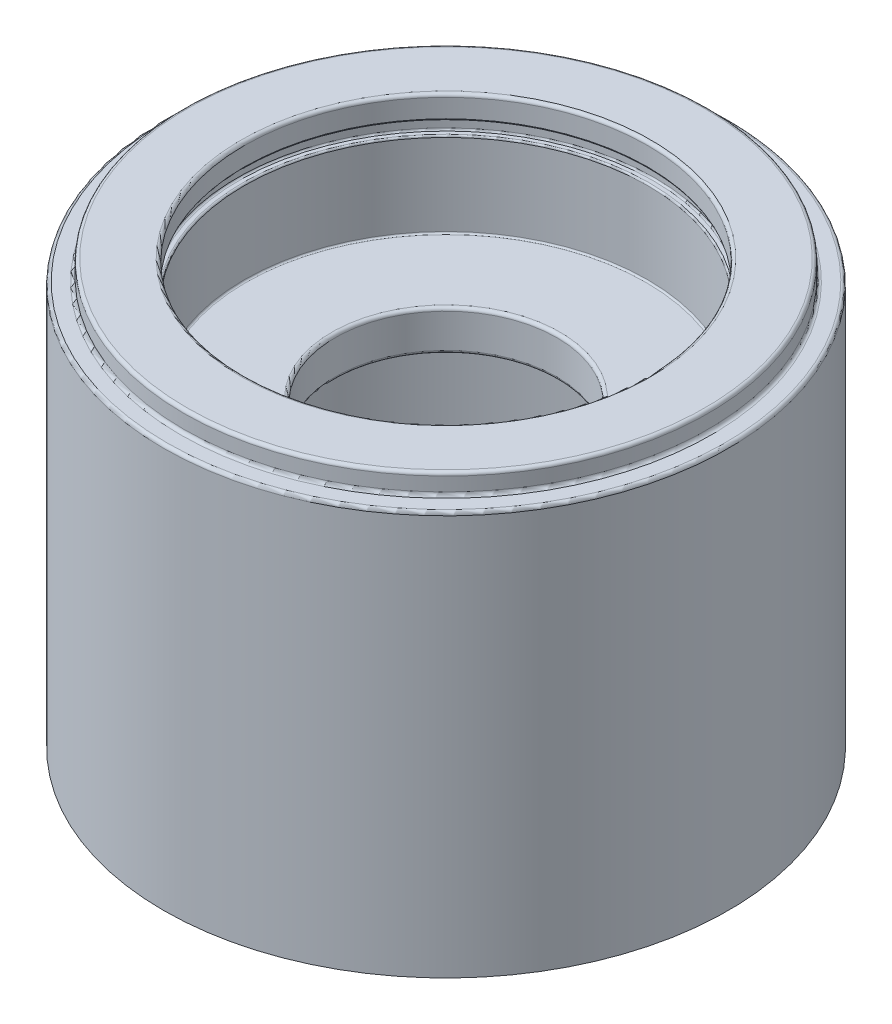
ISO-10303-21;
HEADER;
FILE_DESCRIPTION(('STEP AP214'),'2;1');
FILE_NAME('part.step','',(''),(''),'','','');
FILE_SCHEMA(('AUTOMOTIVE_DESIGN { 1 0 10303 214 1 1 1 1 }'));
ENDSEC;
DATA;
#1=APPLICATION_CONTEXT('core data for automotive mechanical design processes');
#2=APPLICATION_PROTOCOL_DEFINITION('international standard','automotive_design',2000,#1);
#3=PRODUCT_CONTEXT('',#1,'mechanical');
#4=PRODUCT('Part','Part','',(#3));
#5=PRODUCT_RELATED_PRODUCT_CATEGORY('part','',(#4));
#6=PRODUCT_DEFINITION_FORMATION('','',#4);
#7=PRODUCT_DEFINITION_CONTEXT('part definition',#1,'design');
#8=PRODUCT_DEFINITION('design','',#6,#7);
#9=PRODUCT_DEFINITION_SHAPE('','',#8);
#10=(LENGTH_UNIT() NAMED_UNIT(*) SI_UNIT(.MILLI.,.METRE.));
#11=(NAMED_UNIT(*) PLANE_ANGLE_UNIT() SI_UNIT($,.RADIAN.));
#12=(NAMED_UNIT(*) SI_UNIT($,.STERADIAN.) SOLID_ANGLE_UNIT());
#13=UNCERTAINTY_MEASURE_WITH_UNIT(LENGTH_MEASURE(1.E-05),#10,'distance_accuracy_value','');
#14=(GEOMETRIC_REPRESENTATION_CONTEXT(3) GLOBAL_UNCERTAINTY_ASSIGNED_CONTEXT((#13)) GLOBAL_UNIT_ASSIGNED_CONTEXT((#10,
#11,#12)) REPRESENTATION_CONTEXT('',''));
#15=CARTESIAN_POINT('',(0.,0.,0.));
#16=DIRECTION('',(0.,0.,1.));
#17=DIRECTION('',(1.,0.,0.));
#18=AXIS2_PLACEMENT_3D('',#15,#16,#17);
#19=CARTESIAN_POINT('',(0.,105.,0.));
#20=DIRECTION('',(0.,1.,0.));
#21=DIRECTION('',(0.,0.,1.));
#22=AXIS2_PLACEMENT_3D('',#19,#20,#21);
#23=PLANE('',#22);
#24=CARTESIAN_POINT('',(0.,105.,0.));
#25=DIRECTION('',(0.,1.,0.));
#26=DIRECTION('',(0.,0.,1.));
#27=AXIS2_PLACEMENT_3D('',#24,#25,#26);
#28=CIRCLE('',#27,50.8);
#29=CARTESIAN_POINT('',(0.,105.,50.8));
#30=VERTEX_POINT('',#29);
#31=EDGE_CURVE('E97',#30,#30,#28,.F.);
#32=ORIENTED_EDGE('',*,*,#31,.T.);
#33=EDGE_LOOP('',(#32));
#34=FACE_BOUND('',#33,.T.);
#35=CARTESIAN_POINT('',(0.,105.,0.));
#36=DIRECTION('',(0.,1.,0.));
#37=DIRECTION('',(0.,0.,1.));
#38=AXIS2_PLACEMENT_3D('',#35,#36,#37);
#39=CIRCLE('',#38,64.2);
#40=CARTESIAN_POINT('',(0.,105.,64.2));
#41=VERTEX_POINT('',#40);
#42=EDGE_CURVE('E101',#41,#41,#39,.T.);
#43=ORIENTED_EDGE('',*,*,#42,.T.);
#44=EDGE_LOOP('',(#43));
#45=FACE_BOUND('',#44,.T.);
#46=ADVANCED_FACE('F45',(#34,#45),#23,.T.);
#47=CARTESIAN_POINT('',(0.,105.,0.));
#48=DIRECTION('',(0.,-1.,0.));
#49=DIRECTION('',(0.,0.,-1.));
#50=AXIS2_PLACEMENT_3D('',#47,#48,#49);
#51=CYLINDRICAL_SURFACE('',#50,70.);
#52=CARTESIAN_POINT('',(0.,99.2,0.));
#53=DIRECTION('',(0.,1.,0.));
#54=DIRECTION('',(0.,0.,1.));
#55=AXIS2_PLACEMENT_3D('',#52,#53,#54);
#56=CIRCLE('',#55,70.);
#57=CARTESIAN_POINT('',(0.,99.2,70.));
#58=VERTEX_POINT('',#57);
#59=EDGE_CURVE('E77',#58,#58,#56,.F.);
#60=ORIENTED_EDGE('',*,*,#59,.T.);
#61=EDGE_LOOP('',(#60));
#62=FACE_BOUND('',#61,.T.);
#63=CARTESIAN_POINT('',(0.,0.,0.));
#64=DIRECTION('',(0.,1.,0.));
#65=DIRECTION('',(0.,0.,1.));
#66=AXIS2_PLACEMENT_3D('',#63,#64,#65);
#67=CIRCLE('',#66,70.);
#68=CARTESIAN_POINT('',(0.,0.,70.));
#69=VERTEX_POINT('',#68);
#70=EDGE_CURVE('E149',#69,#69,#67,.T.);
#71=ORIENTED_EDGE('',*,*,#70,.T.);
#72=EDGE_LOOP('',(#71));
#73=FACE_BOUND('',#72,.T.);
#74=ADVANCED_FACE('F178',(#62,#73),#51,.T.);
#75=CARTESIAN_POINT('',(0.,75.,0.));
#76=DIRECTION('',(0.,1.,0.));
#77=DIRECTION('',(0.,0.,1.));
#78=AXIS2_PLACEMENT_3D('',#75,#76,#77);
#79=CYLINDRICAL_SURFACE('',#78,50.);
#80=CARTESIAN_POINT('',(0.,104.2,0.));
#81=DIRECTION('',(0.,1.,0.));
#82=DIRECTION('',(0.,0.,1.));
#83=AXIS2_PLACEMENT_3D('',#80,#81,#82);
#84=CIRCLE('',#83,50.);
#85=CARTESIAN_POINT('',(0.,104.2,50.));
#86=VERTEX_POINT('',#85);
#87=EDGE_CURVE('E105',#86,#86,#84,.T.);
#88=ORIENTED_EDGE('',*,*,#87,.T.);
#89=EDGE_LOOP('',(#88));
#90=FACE_BOUND('',#89,.T.);
#91=CARTESIAN_POINT('',(0.,99.6,0.));
#92=DIRECTION('',(0.,1.,0.));
#93=DIRECTION('',(0.,0.,1.));
#94=AXIS2_PLACEMENT_3D('',#91,#92,#93);
#95=CIRCLE('',#94,50.);
#96=CARTESIAN_POINT('',(0.,99.6,50.));
#97=VERTEX_POINT('',#96);
#98=EDGE_CURVE('E141',#97,#97,#95,.F.);
#99=ORIENTED_EDGE('',*,*,#98,.T.);
#100=EDGE_LOOP('',(#99));
#101=FACE_BOUND('',#100,.T.);
#102=ADVANCED_FACE('F173',(#90,#101),#79,.F.);
#103=CARTESIAN_POINT('',(0.,65.,0.));
#104=DIRECTION('',(0.,1.,0.));
#105=DIRECTION('',(0.,0.,1.));
#106=AXIS2_PLACEMENT_3D('',#103,#104,#105);
#107=CYLINDRICAL_SURFACE('',#106,27.5);
#108=CARTESIAN_POINT('',(0.,65.8,0.));
#109=DIRECTION('',(0.,1.,0.));
#110=DIRECTION('',(0.,0.,1.));
#111=AXIS2_PLACEMENT_3D('',#108,#109,#110);
#112=CIRCLE('',#111,27.5);
#113=CARTESIAN_POINT('',(0.,65.8,27.5));
#114=VERTEX_POINT('',#113);
#115=EDGE_CURVE('E53',#114,#114,#112,.F.);
#116=ORIENTED_EDGE('',*,*,#115,.T.);
#117=EDGE_LOOP('',(#116));
#118=FACE_BOUND('',#117,.T.);
#119=CARTESIAN_POINT('',(0.,74.2,0.));
#120=DIRECTION('',(0.,1.,0.));
#121=DIRECTION('',(0.,0.,1.));
#122=AXIS2_PLACEMENT_3D('',#119,#120,#121);
#123=CIRCLE('',#122,27.5);
#124=CARTESIAN_POINT('',(0.,74.2,27.5));
#125=VERTEX_POINT('',#124);
#126=EDGE_CURVE('E58',#125,#125,#123,.T.);
#127=ORIENTED_EDGE('',*,*,#126,.T.);
#128=EDGE_LOOP('',(#127));
#129=FACE_BOUND('',#128,.T.);
#130=ADVANCED_FACE('F162',(#118,#129),#107,.F.);
#131=CARTESIAN_POINT('',(0.,105.,0.));
#132=DIRECTION('',(0.,-1.,0.));
#133=DIRECTION('',(0.,0.,-1.));
#134=AXIS2_PLACEMENT_3D('',#131,#132,#133);
#135=CYLINDRICAL_SURFACE('',#134,65.);
#136=CARTESIAN_POINT('',(0.,64.2,0.));
#137=DIRECTION('',(0.,1.,0.));
#138=DIRECTION('',(0.,0.,1.));
#139=AXIS2_PLACEMENT_3D('',#136,#137,#138);
#140=CIRCLE('',#139,65.);
#141=CARTESIAN_POINT('',(0.,64.2,65.));
#142=VERTEX_POINT('',#141);
#143=EDGE_CURVE('E73',#142,#142,#140,.T.);
#144=ORIENTED_EDGE('',*,*,#143,.T.);
#145=EDGE_LOOP('',(#144));
#146=FACE_BOUND('',#145,.T.);
#147=CARTESIAN_POINT('',(0.,0.,0.));
#148=DIRECTION('',(0.,1.,0.));
#149=DIRECTION('',(0.,0.,1.));
#150=AXIS2_PLACEMENT_3D('',#147,#148,#149);
#151=CIRCLE('',#150,65.);
#152=CARTESIAN_POINT('',(0.,0.,65.));
#153=VERTEX_POINT('',#152);
#154=EDGE_CURVE('E153',#153,#153,#151,.T.);
#155=ORIENTED_EDGE('',*,*,#154,.F.);
#156=EDGE_LOOP('',(#155));
#157=FACE_BOUND('',#156,.T.);
#158=ADVANCED_FACE('F160',(#146,#157),#135,.F.);
#159=CARTESIAN_POINT('',(0.,0.,0.));
#160=DIRECTION('',(0.,1.,0.));
#161=DIRECTION('',(0.,0.,1.));
#162=AXIS2_PLACEMENT_3D('',#159,#160,#161);
#163=PLANE('',#162);
#164=ORIENTED_EDGE('',*,*,#70,.F.);
#165=EDGE_LOOP('',(#164));
#166=FACE_BOUND('',#165,.T.);
#167=ORIENTED_EDGE('',*,*,#154,.T.);
#168=EDGE_LOOP('',(#167));
#169=FACE_BOUND('',#168,.T.);
#170=ADVANCED_FACE('F158',(#166,#169),#163,.F.);
#171=CARTESIAN_POINT('',(0.,65.,0.));
#172=DIRECTION('',(0.,1.,0.));
#173=DIRECTION('',(0.,0.,1.));
#174=AXIS2_PLACEMENT_3D('',#171,#172,#173);
#175=PLANE('',#174);
#176=CARTESIAN_POINT('',(0.,65.,0.));
#177=DIRECTION('',(0.,1.,0.));
#178=DIRECTION('',(0.,0.,1.));
#179=AXIS2_PLACEMENT_3D('',#176,#177,#178);
#180=CIRCLE('',#179,64.2);
#181=CARTESIAN_POINT('',(0.,65.,64.2));
#182=VERTEX_POINT('',#181);
#183=EDGE_CURVE('E63',#182,#182,#180,.F.);
#184=ORIENTED_EDGE('',*,*,#183,.T.);
#185=EDGE_LOOP('',(#184));
#186=FACE_BOUND('',#185,.T.);
#187=CARTESIAN_POINT('',(0.,65.,0.));
#188=DIRECTION('',(0.,1.,0.));
#189=DIRECTION('',(0.,0.,1.));
#190=AXIS2_PLACEMENT_3D('',#187,#188,#189);
#191=CIRCLE('',#190,28.3);
#192=CARTESIAN_POINT('',(0.,65.,28.3));
#193=VERTEX_POINT('',#192);
#194=EDGE_CURVE('E69',#193,#193,#191,.T.);
#195=ORIENTED_EDGE('',*,*,#194,.T.);
#196=EDGE_LOOP('',(#195));
#197=FACE_BOUND('',#196,.T.);
#198=ADVANCED_FACE('F170',(#186,#197),#175,.F.);
#199=CARTESIAN_POINT('',(0.,95.6,0.));
#200=DIRECTION('',(0.,-1.,0.));
#201=DIRECTION('',(0.,0.,-1.));
#202=AXIS2_PLACEMENT_3D('',#199,#200,#201);
#203=CIRCLE('',#202,50.);
#204=CARTESIAN_POINT('',(0.,95.6,-50.));
#205=VERTEX_POINT('',#204);
#206=EDGE_CURVE('E121',#205,#205,#203,.F.);
#207=ORIENTED_EDGE('',*,*,#206,.T.);
#208=EDGE_LOOP('',(#207));
#209=FACE_BOUND('',#208,.T.);
#210=CARTESIAN_POINT('',(0.,75.4,0.));
#211=DIRECTION('',(0.,1.,0.));
#212=DIRECTION('',(0.,0.,1.));
#213=AXIS2_PLACEMENT_3D('',#210,#211,#212);
#214=CIRCLE('',#213,50.);
#215=CARTESIAN_POINT('',(0.,75.4,50.));
#216=VERTEX_POINT('',#215);
#217=EDGE_CURVE('E125',#216,#216,#214,.F.);
#218=ORIENTED_EDGE('',*,*,#217,.T.);
#219=EDGE_LOOP('',(#218));
#220=FACE_BOUND('',#219,.T.);
#221=ADVANCED_FACE('F239',(#209,#220),#79,.F.);
#222=CARTESIAN_POINT('',(0.,75.,0.));
#223=DIRECTION('',(0.,1.,0.));
#224=DIRECTION('',(0.,0.,1.));
#225=AXIS2_PLACEMENT_3D('',#222,#223,#224);
#226=PLANE('',#225);
#227=CARTESIAN_POINT('',(0.,75.,0.));
#228=DIRECTION('',(0.,1.,0.));
#229=DIRECTION('',(0.,0.,1.));
#230=AXIS2_PLACEMENT_3D('',#227,#228,#229);
#231=CIRCLE('',#230,28.3);
#232=CARTESIAN_POINT('',(0.,75.,28.3));
#233=VERTEX_POINT('',#232);
#234=EDGE_CURVE('E10',#233,#233,#231,.F.);
#235=ORIENTED_EDGE('',*,*,#234,.T.);
#236=EDGE_LOOP('',(#235));
#237=FACE_BOUND('',#236,.T.);
#238=CARTESIAN_POINT('',(0.,75.,0.));
#239=DIRECTION('',(0.,1.,0.));
#240=DIRECTION('',(0.,0.,1.));
#241=AXIS2_PLACEMENT_3D('',#238,#239,#240);
#242=CIRCLE('',#241,49.6);
#243=CARTESIAN_POINT('',(0.,75.,49.6));
#244=VERTEX_POINT('',#243);
#245=EDGE_CURVE('E117',#244,#244,#242,.T.);
#246=ORIENTED_EDGE('',*,*,#245,.T.);
#247=EDGE_LOOP('',(#246));
#248=FACE_BOUND('',#247,.T.);
#249=ADVANCED_FACE('F245',(#237,#248),#226,.T.);
#250=CARTESIAN_POINT('',(-50.,99.2,0.));
#251=DIRECTION('',(0.,1.,0.));
#252=DIRECTION('',(0.,0.,1.));
#253=AXIS2_PLACEMENT_3D('',#250,#251,#252);
#254=PLANE('',#253);
#255=CARTESIAN_POINT('',(0.,99.2,0.));
#256=DIRECTION('',(0.,1.,0.));
#257=DIRECTION('',(0.,0.,1.));
#258=AXIS2_PLACEMENT_3D('',#255,#256,#257);
#259=CIRCLE('',#258,51.35);
#260=CARTESIAN_POINT('',(0.,99.2,51.35));
#261=VERTEX_POINT('',#260);
#262=EDGE_CURVE('E109',#261,#261,#259,.F.);
#263=ORIENTED_EDGE('',*,*,#262,.T.);
#264=EDGE_LOOP('',(#263));
#265=FACE_BOUND('',#264,.T.);
#266=CARTESIAN_POINT('',(0.,99.2,0.));
#267=DIRECTION('',(0.,1.,0.));
#268=DIRECTION('',(0.,0.,1.));
#269=AXIS2_PLACEMENT_3D('',#266,#267,#268);
#270=CIRCLE('',#269,50.4);
#271=CARTESIAN_POINT('',(0.,99.2,50.4));
#272=VERTEX_POINT('',#271);
#273=EDGE_CURVE('E145',#272,#272,#270,.T.);
#274=ORIENTED_EDGE('',*,*,#273,.T.);
#275=EDGE_LOOP('',(#274));
#276=FACE_BOUND('',#275,.T.);
#277=ADVANCED_FACE('F250',(#265,#276),#254,.F.);
#278=CARTESIAN_POINT('',(0.,105.,0.));
#279=DIRECTION('',(0.,1.,0.));
#280=DIRECTION('',(0.,0.,1.));
#281=AXIS2_PLACEMENT_3D('',#278,#279,#280);
#282=CYLINDRICAL_SURFACE('',#281,51.75);
#283=CARTESIAN_POINT('',(0.,98.8,0.));
#284=DIRECTION('',(0.,1.,0.));
#285=DIRECTION('',(0.,0.,1.));
#286=AXIS2_PLACEMENT_3D('',#283,#284,#285);
#287=CIRCLE('',#286,51.75);
#288=CARTESIAN_POINT('',(0.,98.8,51.75));
#289=VERTEX_POINT('',#288);
#290=EDGE_CURVE('E113',#289,#289,#287,.T.);
#291=ORIENTED_EDGE('',*,*,#290,.T.);
#292=EDGE_LOOP('',(#291));
#293=FACE_BOUND('',#292,.T.);
#294=CARTESIAN_POINT('',(0.,96.4,0.));
#295=DIRECTION('',(0.,-1.,0.));
#296=DIRECTION('',(0.,0.,-1.));
#297=AXIS2_PLACEMENT_3D('',#294,#295,#296);
#298=CIRCLE('',#297,51.75);
#299=CARTESIAN_POINT('',(0.,96.4,-51.75));
#300=VERTEX_POINT('',#299);
#301=EDGE_CURVE('E129',#300,#300,#298,.T.);
#302=ORIENTED_EDGE('',*,*,#301,.T.);
#303=EDGE_LOOP('',(#302));
#304=FACE_BOUND('',#303,.T.);
#305=ADVANCED_FACE('F253',(#293,#304),#282,.F.);
#306=CARTESIAN_POINT('',(-50.,96.,0.));
#307=DIRECTION('',(0.,-1.,0.));
#308=DIRECTION('',(0.,0.,-1.));
#309=AXIS2_PLACEMENT_3D('',#306,#307,#308);
#310=PLANE('',#309);
#311=CARTESIAN_POINT('',(0.,96.,0.));
#312=DIRECTION('',(0.,-1.,0.));
#313=DIRECTION('',(0.,0.,-1.));
#314=AXIS2_PLACEMENT_3D('',#311,#312,#313);
#315=CIRCLE('',#314,51.35);
#316=CARTESIAN_POINT('',(0.,96.,-51.35));
#317=VERTEX_POINT('',#316);
#318=EDGE_CURVE('E133',#317,#317,#315,.F.);
#319=ORIENTED_EDGE('',*,*,#318,.T.);
#320=EDGE_LOOP('',(#319));
#321=FACE_BOUND('',#320,.T.);
#322=CARTESIAN_POINT('',(0.,96.,0.));
#323=DIRECTION('',(0.,-1.,0.));
#324=DIRECTION('',(0.,0.,-1.));
#325=AXIS2_PLACEMENT_3D('',#322,#323,#324);
#326=CIRCLE('',#325,50.4);
#327=CARTESIAN_POINT('',(0.,96.,-50.4));
#328=VERTEX_POINT('',#327);
#329=EDGE_CURVE('E137',#328,#328,#326,.T.);
#330=ORIENTED_EDGE('',*,*,#329,.T.);
#331=EDGE_LOOP('',(#330));
#332=FACE_BOUND('',#331,.T.);
#333=ADVANCED_FACE('F192',(#321,#332),#310,.F.);
#334=CARTESIAN_POINT('',(0.,99.6,0.));
#335=DIRECTION('',(0.,1.,0.));
#336=DIRECTION('',(0.,0.,1.));
#337=AXIS2_PLACEMENT_3D('',#334,#335,#336);
#338=TOROIDAL_SURFACE('',#337,50.4,0.4);
#339=ORIENTED_EDGE('',*,*,#98,.F.);
#340=EDGE_LOOP('',(#339));
#341=FACE_BOUND('',#340,.T.);
#342=ORIENTED_EDGE('',*,*,#273,.F.);
#343=EDGE_LOOP('',(#342));
#344=FACE_BOUND('',#343,.T.);
#345=ADVANCED_FACE('F188',(#341,#344),#338,.T.);
#346=CARTESIAN_POINT('',(0.,96.4,0.));
#347=DIRECTION('',(0.,-1.,0.));
#348=DIRECTION('',(0.,0.,-1.));
#349=AXIS2_PLACEMENT_3D('',#346,#347,#348);
#350=TOROIDAL_SURFACE('',#349,51.35,0.4);
#351=ORIENTED_EDGE('',*,*,#301,.F.);
#352=EDGE_LOOP('',(#351));
#353=FACE_BOUND('',#352,.T.);
#354=ORIENTED_EDGE('',*,*,#318,.F.);
#355=EDGE_LOOP('',(#354));
#356=FACE_BOUND('',#355,.T.);
#357=ADVANCED_FACE('F191',(#353,#356),#350,.F.);
#358=CARTESIAN_POINT('',(0.,95.6,0.));
#359=DIRECTION('',(0.,-1.,0.));
#360=DIRECTION('',(0.,0.,-1.));
#361=AXIS2_PLACEMENT_3D('',#358,#359,#360);
#362=TOROIDAL_SURFACE('',#361,50.4,0.4);
#363=ORIENTED_EDGE('',*,*,#329,.F.);
#364=EDGE_LOOP('',(#363));
#365=FACE_BOUND('',#364,.T.);
#366=ORIENTED_EDGE('',*,*,#206,.F.);
#367=EDGE_LOOP('',(#366));
#368=FACE_BOUND('',#367,.T.);
#369=ADVANCED_FACE('F196',(#365,#368),#362,.T.);
#370=CARTESIAN_POINT('',(0.,75.4,0.));
#371=DIRECTION('',(0.,1.,0.));
#372=DIRECTION('',(0.,0.,1.));
#373=AXIS2_PLACEMENT_3D('',#370,#371,#372);
#374=TOROIDAL_SURFACE('',#373,49.6,0.4);
#375=ORIENTED_EDGE('',*,*,#217,.F.);
#376=EDGE_LOOP('',(#375));
#377=FACE_BOUND('',#376,.T.);
#378=ORIENTED_EDGE('',*,*,#245,.F.);
#379=EDGE_LOOP('',(#378));
#380=FACE_BOUND('',#379,.T.);
#381=ADVANCED_FACE('F200',(#377,#380),#374,.F.);
#382=CARTESIAN_POINT('',(0.,98.8,0.));
#383=DIRECTION('',(0.,1.,0.));
#384=DIRECTION('',(0.,0.,1.));
#385=AXIS2_PLACEMENT_3D('',#382,#383,#384);
#386=TOROIDAL_SURFACE('',#385,51.35,0.4);
#387=ORIENTED_EDGE('',*,*,#262,.F.);
#388=EDGE_LOOP('',(#387));
#389=FACE_BOUND('',#388,.T.);
#390=ORIENTED_EDGE('',*,*,#290,.F.);
#391=EDGE_LOOP('',(#390));
#392=FACE_BOUND('',#391,.T.);
#393=ADVANCED_FACE('F204',(#389,#392),#386,.F.);
#394=CARTESIAN_POINT('',(0.,100.,0.));
#395=DIRECTION('',(0.,1.,0.));
#396=DIRECTION('',(0.,0.,1.));
#397=AXIS2_PLACEMENT_3D('',#394,#395,#396);
#398=PLANE('',#397);
#399=CARTESIAN_POINT('',(0.,100.,0.));
#400=DIRECTION('',(0.,1.,0.));
#401=DIRECTION('',(0.,0.,1.));
#402=AXIS2_PLACEMENT_3D('',#399,#400,#401);
#403=CIRCLE('',#402,65.8);
#404=CARTESIAN_POINT('',(0.,100.,65.8));
#405=VERTEX_POINT('',#404);
#406=EDGE_CURVE('E81',#405,#405,#403,.F.);
#407=ORIENTED_EDGE('',*,*,#406,.T.);
#408=EDGE_LOOP('',(#407));
#409=FACE_BOUND('',#408,.T.);
#410=CARTESIAN_POINT('',(0.,100.,0.));
#411=DIRECTION('',(0.,1.,0.));
#412=DIRECTION('',(0.,0.,1.));
#413=AXIS2_PLACEMENT_3D('',#410,#411,#412);
#414=CIRCLE('',#413,69.2);
#415=CARTESIAN_POINT('',(0.,100.,69.2));
#416=VERTEX_POINT('',#415);
#417=EDGE_CURVE('E85',#416,#416,#414,.T.);
#418=ORIENTED_EDGE('',*,*,#417,.T.);
#419=EDGE_LOOP('',(#418));
#420=FACE_BOUND('',#419,.T.);
#421=ADVANCED_FACE('F207',(#409,#420),#398,.T.);
#422=CARTESIAN_POINT('',(0.,100.,0.));
#423=DIRECTION('',(0.,1.,0.));
#424=DIRECTION('',(0.,0.,1.));
#425=AXIS2_PLACEMENT_3D('',#422,#423,#424);
#426=CYLINDRICAL_SURFACE('',#425,65.);
#427=CARTESIAN_POINT('',(0.,104.2,0.));
#428=DIRECTION('',(0.,1.,0.));
#429=DIRECTION('',(0.,0.,1.));
#430=AXIS2_PLACEMENT_3D('',#427,#428,#429);
#431=CIRCLE('',#430,65.);
#432=CARTESIAN_POINT('',(0.,104.2,65.));
#433=VERTEX_POINT('',#432);
#434=EDGE_CURVE('E89',#433,#433,#431,.F.);
#435=ORIENTED_EDGE('',*,*,#434,.T.);
#436=EDGE_LOOP('',(#435));
#437=FACE_BOUND('',#436,.T.);
#438=CARTESIAN_POINT('',(0.,100.8,0.));
#439=DIRECTION('',(0.,1.,0.));
#440=DIRECTION('',(0.,0.,1.));
#441=AXIS2_PLACEMENT_3D('',#438,#439,#440);
#442=CIRCLE('',#441,65.);
#443=CARTESIAN_POINT('',(0.,100.8,65.));
#444=VERTEX_POINT('',#443);
#445=EDGE_CURVE('E93',#444,#444,#442,.T.);
#446=ORIENTED_EDGE('',*,*,#445,.T.);
#447=EDGE_LOOP('',(#446));
#448=FACE_BOUND('',#447,.T.);
#449=ADVANCED_FACE('F213',(#437,#448),#426,.T.);
#450=CARTESIAN_POINT('',(0.,104.2,0.));
#451=DIRECTION('',(0.,1.,0.));
#452=DIRECTION('',(0.,0.,1.));
#453=AXIS2_PLACEMENT_3D('',#450,#451,#452);
#454=TOROIDAL_SURFACE('',#453,50.8,0.8);
#455=ORIENTED_EDGE('',*,*,#31,.F.);
#456=EDGE_LOOP('',(#455));
#457=FACE_BOUND('',#456,.T.);
#458=ORIENTED_EDGE('',*,*,#87,.F.);
#459=EDGE_LOOP('',(#458));
#460=FACE_BOUND('',#459,.T.);
#461=ADVANCED_FACE('F209',(#457,#460),#454,.T.);
#462=CARTESIAN_POINT('',(0.,104.2,0.));
#463=DIRECTION('',(0.,1.,0.));
#464=DIRECTION('',(0.,0.,1.));
#465=AXIS2_PLACEMENT_3D('',#462,#463,#464);
#466=TOROIDAL_SURFACE('',#465,64.2,0.8);
#467=ORIENTED_EDGE('',*,*,#434,.F.);
#468=EDGE_LOOP('',(#467));
#469=FACE_BOUND('',#468,.T.);
#470=ORIENTED_EDGE('',*,*,#42,.F.);
#471=EDGE_LOOP('',(#470));
#472=FACE_BOUND('',#471,.T.);
#473=ADVANCED_FACE('F212',(#469,#472),#466,.T.);
#474=CARTESIAN_POINT('',(0.,100.8,0.));
#475=DIRECTION('',(0.,1.,0.));
#476=DIRECTION('',(0.,0.,1.));
#477=AXIS2_PLACEMENT_3D('',#474,#475,#476);
#478=TOROIDAL_SURFACE('',#477,65.8,0.8);
#479=ORIENTED_EDGE('',*,*,#406,.F.);
#480=EDGE_LOOP('',(#479));
#481=FACE_BOUND('',#480,.T.);
#482=ORIENTED_EDGE('',*,*,#445,.F.);
#483=EDGE_LOOP('',(#482));
#484=FACE_BOUND('',#483,.T.);
#485=ADVANCED_FACE('F217',(#481,#484),#478,.F.);
#486=CARTESIAN_POINT('',(0.,99.2,0.));
#487=DIRECTION('',(0.,1.,0.));
#488=DIRECTION('',(0.,0.,1.));
#489=AXIS2_PLACEMENT_3D('',#486,#487,#488);
#490=TOROIDAL_SURFACE('',#489,69.2,0.8);
#491=ORIENTED_EDGE('',*,*,#59,.F.);
#492=EDGE_LOOP('',(#491));
#493=FACE_BOUND('',#492,.T.);
#494=ORIENTED_EDGE('',*,*,#417,.F.);
#495=EDGE_LOOP('',(#494));
#496=FACE_BOUND('',#495,.T.);
#497=ADVANCED_FACE('F221',(#493,#496),#490,.T.);
#498=CARTESIAN_POINT('',(0.,64.2,0.));
#499=DIRECTION('',(0.,1.,0.));
#500=DIRECTION('',(0.,0.,1.));
#501=AXIS2_PLACEMENT_3D('',#498,#499,#500);
#502=TOROIDAL_SURFACE('',#501,64.2,0.8);
#503=ORIENTED_EDGE('',*,*,#183,.F.);
#504=EDGE_LOOP('',(#503));
#505=FACE_BOUND('',#504,.T.);
#506=ORIENTED_EDGE('',*,*,#143,.F.);
#507=EDGE_LOOP('',(#506));
#508=FACE_BOUND('',#507,.T.);
#509=ADVANCED_FACE('F225',(#505,#508),#502,.F.);
#510=CARTESIAN_POINT('',(0.,65.8,0.));
#511=DIRECTION('',(0.,1.,0.));
#512=DIRECTION('',(0.,0.,1.));
#513=AXIS2_PLACEMENT_3D('',#510,#511,#512);
#514=TOROIDAL_SURFACE('',#513,28.3,0.8);
#515=ORIENTED_EDGE('',*,*,#115,.F.);
#516=EDGE_LOOP('',(#515));
#517=FACE_BOUND('',#516,.T.);
#518=ORIENTED_EDGE('',*,*,#194,.F.);
#519=EDGE_LOOP('',(#518));
#520=FACE_BOUND('',#519,.T.);
#521=ADVANCED_FACE('F228',(#517,#520),#514,.T.);
#522=CARTESIAN_POINT('',(0.,74.2,0.));
#523=DIRECTION('',(0.,1.,0.));
#524=DIRECTION('',(0.,0.,1.));
#525=AXIS2_PLACEMENT_3D('',#522,#523,#524);
#526=TOROIDAL_SURFACE('',#525,28.3,0.8);
#527=ORIENTED_EDGE('',*,*,#234,.F.);
#528=EDGE_LOOP('',(#527));
#529=FACE_BOUND('',#528,.T.);
#530=ORIENTED_EDGE('',*,*,#126,.F.);
#531=EDGE_LOOP('',(#530));
#532=FACE_BOUND('',#531,.T.);
#533=ADVANCED_FACE('F47',(#529,#532),#526,.T.);
#534=CLOSED_SHELL('',(#46,#74,#102,#130,#158,#170,#198,#221,#249,#277,#305,#333,#345,#357,#369,
#381,#393,#421,#449,#461,#473,#485,#497,#509,#521,#533));
#535=MANIFOLD_SOLID_BREP('B2',#534);
#536=ADVANCED_BREP_SHAPE_REPRESENTATION('',(#18,#535),#14);
#537=SHAPE_DEFINITION_REPRESENTATION(#9,#536);
ENDSEC;
END-ISO-10303-21;
